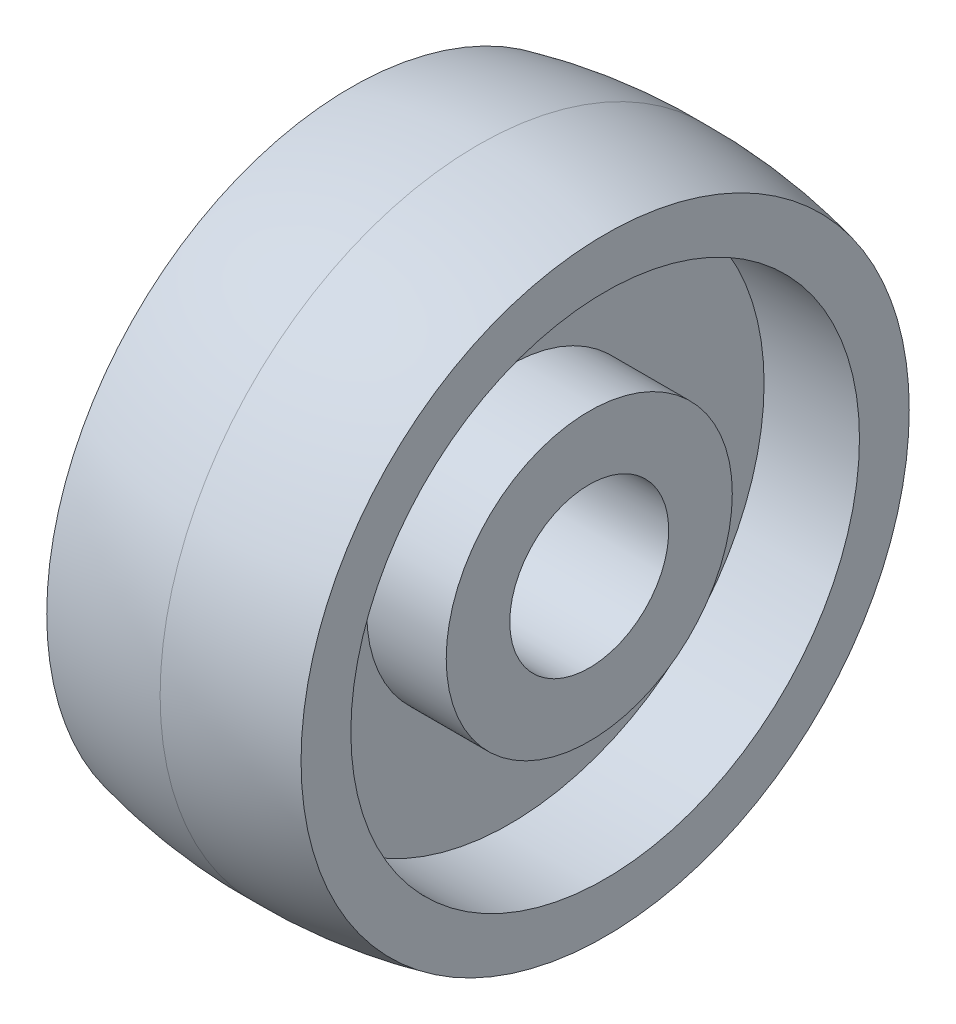
ISO-10303-21;
HEADER;
FILE_DESCRIPTION(('STEP AP214'),'2;1');
FILE_NAME('part.step','',(''),(''),'','','');
FILE_SCHEMA(('AUTOMOTIVE_DESIGN { 1 0 10303 214 1 1 1 1 }'));
ENDSEC;
DATA;
#1=APPLICATION_CONTEXT('core data for automotive mechanical design processes');
#2=APPLICATION_PROTOCOL_DEFINITION('international standard','automotive_design',2000,#1);
#3=PRODUCT_CONTEXT('',#1,'mechanical');
#4=PRODUCT('Part','Part','',(#3));
#5=PRODUCT_RELATED_PRODUCT_CATEGORY('part','',(#4));
#6=PRODUCT_DEFINITION_FORMATION('','',#4);
#7=PRODUCT_DEFINITION_CONTEXT('part definition',#1,'design');
#8=PRODUCT_DEFINITION('design','',#6,#7);
#9=PRODUCT_DEFINITION_SHAPE('','',#8);
#10=(LENGTH_UNIT() NAMED_UNIT(*) SI_UNIT(.MILLI.,.METRE.));
#11=(NAMED_UNIT(*) PLANE_ANGLE_UNIT() SI_UNIT($,.RADIAN.));
#12=(NAMED_UNIT(*) SI_UNIT($,.STERADIAN.) SOLID_ANGLE_UNIT());
#13=UNCERTAINTY_MEASURE_WITH_UNIT(LENGTH_MEASURE(1.E-05),#10,'distance_accuracy_value','');
#14=(GEOMETRIC_REPRESENTATION_CONTEXT(3) GLOBAL_UNCERTAINTY_ASSIGNED_CONTEXT((#13)) GLOBAL_UNIT_ASSIGNED_CONTEXT((#10,
#11,#12)) REPRESENTATION_CONTEXT('',''));
#15=CARTESIAN_POINT('',(0.,0.,0.));
#16=DIRECTION('',(0.,0.,1.));
#17=DIRECTION('',(1.,0.,0.));
#18=AXIS2_PLACEMENT_3D('',#15,#16,#17);
#19=CARTESIAN_POINT('',(1.38981076302772,0.,0.));
#20=DIRECTION('',(-1.,0.,0.));
#21=DIRECTION('',(0.,0.,1.));
#22=AXIS2_PLACEMENT_3D('',#19,#20,#21);
#23=DEGENERATE_TOROIDAL_SURFACE('',#22,13.9980575074667,34.,.F.);
#24=CARTESIAN_POINT('',(-6.24675324675326,0.,0.));
#25=DIRECTION('',(-1.,0.,0.));
#26=DIRECTION('',(0.,0.,1.));
#27=AXIS2_PLACEMENT_3D('',#24,#25,#26);
#28=CIRCLE('',#27,19.1332402353703);
#29=CARTESIAN_POINT('',(-6.24675324675326,0.,19.1332402353703));
#30=VERTEX_POINT('',#29);
#31=EDGE_CURVE('E77',#30,#30,#28,.T.);
#32=ORIENTED_EDGE('',*,*,#31,.F.);
#33=EDGE_LOOP('',(#32));
#34=FACE_BOUND('',#33,.T.);
#35=CARTESIAN_POINT('',(1.75324675324675,0.,0.));
#36=DIRECTION('',(-1.,0.,0.));
#37=DIRECTION('',(0.,0.,1.));
#38=AXIS2_PLACEMENT_3D('',#35,#36,#37);
#39=CIRCLE('',#38,20.);
#40=CARTESIAN_POINT('',(1.75324675324675,0.,20.));
#41=VERTEX_POINT('',#40);
#42=EDGE_CURVE('E10',#41,#41,#39,.T.);
#43=ORIENTED_EDGE('',*,*,#42,.T.);
#44=EDGE_LOOP('',(#43));
#45=FACE_BOUND('',#44,.T.);
#46=ADVANCED_FACE('F34',(#34,#45),#23,.F.);
#47=CARTESIAN_POINT('',(2.11668274346577,0.,0.));
#48=DIRECTION('',(-1.,0.,0.));
#49=DIRECTION('',(0.,0.,1.));
#50=AXIS2_PLACEMENT_3D('',#47,#48,#49);
#51=DEGENERATE_TOROIDAL_SURFACE('',#50,13.9980575074667,34.,.F.);
#52=ORIENTED_EDGE('',*,*,#42,.F.);
#53=EDGE_LOOP('',(#52));
#54=FACE_BOUND('',#53,.T.);
#55=CARTESIAN_POINT('',(9.75324675324674,0.,0.));
#56=DIRECTION('',(-1.,0.,0.));
#57=DIRECTION('',(0.,0.,1.));
#58=AXIS2_PLACEMENT_3D('',#55,#56,#57);
#59=CIRCLE('',#58,19.1332402353703);
#60=CARTESIAN_POINT('',(9.75324675324674,0.,19.1332402353703));
#61=VERTEX_POINT('',#60);
#62=EDGE_CURVE('E40',#61,#61,#59,.T.);
#63=ORIENTED_EDGE('',*,*,#62,.T.);
#64=EDGE_LOOP('',(#63));
#65=FACE_BOUND('',#64,.T.);
#66=ADVANCED_FACE('F84',(#54,#65),#51,.F.);
#67=CARTESIAN_POINT('',(9.75324675324675,16.,0.));
#68=DIRECTION('',(-1.,0.,0.));
#69=DIRECTION('',(0.,0.,1.));
#70=AXIS2_PLACEMENT_3D('',#67,#68,#69);
#71=PLANE('',#70);
#72=ORIENTED_EDGE('',*,*,#62,.F.);
#73=EDGE_LOOP('',(#72));
#74=FACE_BOUND('',#73,.T.);
#75=CARTESIAN_POINT('',(9.75324675324674,0.,0.));
#76=DIRECTION('',(-1.,0.,0.));
#77=DIRECTION('',(0.,0.,1.));
#78=AXIS2_PLACEMENT_3D('',#75,#76,#77);
#79=CIRCLE('',#78,16.);
#80=CARTESIAN_POINT('',(9.75324675324674,0.,16.));
#81=VERTEX_POINT('',#80);
#82=EDGE_CURVE('E44',#81,#81,#79,.T.);
#83=ORIENTED_EDGE('',*,*,#82,.T.);
#84=EDGE_LOOP('',(#83));
#85=FACE_BOUND('',#84,.T.);
#86=ADVANCED_FACE('F88',(#74,#85),#71,.F.);
#87=CARTESIAN_POINT('',(-14.8051948051948,0.,0.));
#88=DIRECTION('',(-1.,0.,0.));
#89=DIRECTION('',(0.,0.,1.));
#90=AXIS2_PLACEMENT_3D('',#87,#88,#89);
#91=CYLINDRICAL_SURFACE('',#90,16.);
#92=ORIENTED_EDGE('',*,*,#82,.F.);
#93=EDGE_LOOP('',(#92));
#94=FACE_BOUND('',#93,.T.);
#95=CARTESIAN_POINT('',(3.75324675324675,0.,0.));
#96=DIRECTION('',(-1.,0.,0.));
#97=DIRECTION('',(0.,0.,1.));
#98=AXIS2_PLACEMENT_3D('',#95,#96,#97);
#99=CIRCLE('',#98,16.);
#100=CARTESIAN_POINT('',(3.75324675324675,0.,16.));
#101=VERTEX_POINT('',#100);
#102=EDGE_CURVE('E48',#101,#101,#99,.T.);
#103=ORIENTED_EDGE('',*,*,#102,.T.);
#104=EDGE_LOOP('',(#103));
#105=FACE_BOUND('',#104,.T.);
#106=ADVANCED_FACE('F93',(#94,#105),#91,.F.);
#107=CARTESIAN_POINT('',(3.75324675324675,9.,0.));
#108=DIRECTION('',(-1.,0.,0.));
#109=DIRECTION('',(0.,0.,1.));
#110=AXIS2_PLACEMENT_3D('',#107,#108,#109);
#111=PLANE('',#110);
#112=ORIENTED_EDGE('',*,*,#102,.F.);
#113=EDGE_LOOP('',(#112));
#114=FACE_BOUND('',#113,.T.);
#115=CARTESIAN_POINT('',(3.75324675324675,0.,0.));
#116=DIRECTION('',(-1.,0.,0.));
#117=DIRECTION('',(0.,0.,1.));
#118=AXIS2_PLACEMENT_3D('',#115,#116,#117);
#119=CIRCLE('',#118,9.);
#120=CARTESIAN_POINT('',(3.75324675324675,0.,9.));
#121=VERTEX_POINT('',#120);
#122=EDGE_CURVE('E53',#121,#121,#119,.T.);
#123=ORIENTED_EDGE('',*,*,#122,.T.);
#124=EDGE_LOOP('',(#123));
#125=FACE_BOUND('',#124,.T.);
#126=ADVANCED_FACE('F99',(#114,#125),#111,.F.);
#127=CARTESIAN_POINT('',(-14.8051948051948,0.,0.));
#128=DIRECTION('',(-1.,0.,0.));
#129=DIRECTION('',(0.,0.,1.));
#130=AXIS2_PLACEMENT_3D('',#127,#128,#129);
#131=CYLINDRICAL_SURFACE('',#130,9.);
#132=ORIENTED_EDGE('',*,*,#122,.F.);
#133=EDGE_LOOP('',(#132));
#134=FACE_BOUND('',#133,.T.);
#135=CARTESIAN_POINT('',(8.75324675324674,0.,0.));
#136=DIRECTION('',(-1.,0.,0.));
#137=DIRECTION('',(0.,0.,1.));
#138=AXIS2_PLACEMENT_3D('',#135,#136,#137);
#139=CIRCLE('',#138,9.);
#140=CARTESIAN_POINT('',(8.75324675324674,0.,9.));
#141=VERTEX_POINT('',#140);
#142=EDGE_CURVE('E56',#141,#141,#139,.T.);
#143=ORIENTED_EDGE('',*,*,#142,.T.);
#144=EDGE_LOOP('',(#143));
#145=FACE_BOUND('',#144,.T.);
#146=ADVANCED_FACE('F103',(#134,#145),#131,.T.);
#147=CARTESIAN_POINT('',(8.75324675324675,5.,0.));
#148=DIRECTION('',(-1.,0.,0.));
#149=DIRECTION('',(0.,0.,1.));
#150=AXIS2_PLACEMENT_3D('',#147,#148,#149);
#151=PLANE('',#150);
#152=ORIENTED_EDGE('',*,*,#142,.F.);
#153=EDGE_LOOP('',(#152));
#154=FACE_BOUND('',#153,.T.);
#155=CARTESIAN_POINT('',(8.75324675324674,0.,0.));
#156=DIRECTION('',(-1.,0.,0.));
#157=DIRECTION('',(0.,0.,1.));
#158=AXIS2_PLACEMENT_3D('',#155,#156,#157);
#159=CIRCLE('',#158,5.);
#160=CARTESIAN_POINT('',(8.75324675324674,0.,5.));
#161=VERTEX_POINT('',#160);
#162=EDGE_CURVE('E59',#161,#161,#159,.T.);
#163=ORIENTED_EDGE('',*,*,#162,.T.);
#164=EDGE_LOOP('',(#163));
#165=FACE_BOUND('',#164,.T.);
#166=ADVANCED_FACE('F107',(#154,#165),#151,.F.);
#167=CARTESIAN_POINT('',(-14.8051948051948,0.,0.));
#168=DIRECTION('',(-1.,0.,0.));
#169=DIRECTION('',(0.,0.,1.));
#170=AXIS2_PLACEMENT_3D('',#167,#168,#169);
#171=CYLINDRICAL_SURFACE('',#170,5.);
#172=ORIENTED_EDGE('',*,*,#162,.F.);
#173=EDGE_LOOP('',(#172));
#174=FACE_BOUND('',#173,.T.);
#175=CARTESIAN_POINT('',(-5.24675324675326,0.,0.));
#176=DIRECTION('',(-1.,0.,0.));
#177=DIRECTION('',(0.,0.,1.));
#178=AXIS2_PLACEMENT_3D('',#175,#176,#177);
#179=CIRCLE('',#178,5.);
#180=CARTESIAN_POINT('',(-5.24675324675326,0.,5.));
#181=VERTEX_POINT('',#180);
#182=EDGE_CURVE('E62',#181,#181,#179,.T.);
#183=ORIENTED_EDGE('',*,*,#182,.T.);
#184=EDGE_LOOP('',(#183));
#185=FACE_BOUND('',#184,.T.);
#186=ADVANCED_FACE('F111',(#174,#185),#171,.F.);
#187=CARTESIAN_POINT('',(-5.24675324675326,5.,0.));
#188=DIRECTION('',(1.,0.,0.));
#189=DIRECTION('',(0.,0.,-1.));
#190=AXIS2_PLACEMENT_3D('',#187,#188,#189);
#191=PLANE('',#190);
#192=ORIENTED_EDGE('',*,*,#182,.F.);
#193=EDGE_LOOP('',(#192));
#194=FACE_BOUND('',#193,.T.);
#195=CARTESIAN_POINT('',(-5.24675324675326,0.,0.));
#196=DIRECTION('',(-1.,0.,0.));
#197=DIRECTION('',(0.,0.,1.));
#198=AXIS2_PLACEMENT_3D('',#195,#196,#197);
#199=CIRCLE('',#198,9.);
#200=CARTESIAN_POINT('',(-5.24675324675326,0.,9.));
#201=VERTEX_POINT('',#200);
#202=EDGE_CURVE('E65',#201,#201,#199,.T.);
#203=ORIENTED_EDGE('',*,*,#202,.T.);
#204=EDGE_LOOP('',(#203));
#205=FACE_BOUND('',#204,.T.);
#206=ADVANCED_FACE('F115',(#194,#205),#191,.F.);
#207=CARTESIAN_POINT('',(-14.8051948051948,0.,0.));
#208=DIRECTION('',(-1.,0.,0.));
#209=DIRECTION('',(0.,0.,1.));
#210=AXIS2_PLACEMENT_3D('',#207,#208,#209);
#211=CYLINDRICAL_SURFACE('',#210,9.);
#212=ORIENTED_EDGE('',*,*,#202,.F.);
#213=EDGE_LOOP('',(#212));
#214=FACE_BOUND('',#213,.T.);
#215=CARTESIAN_POINT('',(-0.246753246753254,0.,0.));
#216=DIRECTION('',(-1.,0.,0.));
#217=DIRECTION('',(0.,0.,1.));
#218=AXIS2_PLACEMENT_3D('',#215,#216,#217);
#219=CIRCLE('',#218,9.);
#220=CARTESIAN_POINT('',(-0.246753246753254,0.,9.));
#221=VERTEX_POINT('',#220);
#222=EDGE_CURVE('E68',#221,#221,#219,.T.);
#223=ORIENTED_EDGE('',*,*,#222,.T.);
#224=EDGE_LOOP('',(#223));
#225=FACE_BOUND('',#224,.T.);
#226=ADVANCED_FACE('F119',(#214,#225),#211,.T.);
#227=CARTESIAN_POINT('',(-0.246753246753255,9.,0.));
#228=DIRECTION('',(1.,0.,0.));
#229=DIRECTION('',(0.,0.,-1.));
#230=AXIS2_PLACEMENT_3D('',#227,#228,#229);
#231=PLANE('',#230);
#232=ORIENTED_EDGE('',*,*,#222,.F.);
#233=EDGE_LOOP('',(#232));
#234=FACE_BOUND('',#233,.T.);
#235=CARTESIAN_POINT('',(-0.246753246753254,0.,0.));
#236=DIRECTION('',(-1.,0.,0.));
#237=DIRECTION('',(0.,0.,1.));
#238=AXIS2_PLACEMENT_3D('',#235,#236,#237);
#239=CIRCLE('',#238,16.);
#240=CARTESIAN_POINT('',(-0.246753246753254,0.,16.));
#241=VERTEX_POINT('',#240);
#242=EDGE_CURVE('E71',#241,#241,#239,.T.);
#243=ORIENTED_EDGE('',*,*,#242,.T.);
#244=EDGE_LOOP('',(#243));
#245=FACE_BOUND('',#244,.T.);
#246=ADVANCED_FACE('F123',(#234,#245),#231,.F.);
#247=CARTESIAN_POINT('',(-14.8051948051948,0.,0.));
#248=DIRECTION('',(-1.,0.,0.));
#249=DIRECTION('',(0.,0.,1.));
#250=AXIS2_PLACEMENT_3D('',#247,#248,#249);
#251=CYLINDRICAL_SURFACE('',#250,16.);
#252=ORIENTED_EDGE('',*,*,#242,.F.);
#253=EDGE_LOOP('',(#252));
#254=FACE_BOUND('',#253,.T.);
#255=CARTESIAN_POINT('',(-6.24675324675325,0.,0.));
#256=DIRECTION('',(-1.,0.,0.));
#257=DIRECTION('',(0.,0.,1.));
#258=AXIS2_PLACEMENT_3D('',#255,#256,#257);
#259=CIRCLE('',#258,16.);
#260=CARTESIAN_POINT('',(-6.24675324675325,0.,16.));
#261=VERTEX_POINT('',#260);
#262=EDGE_CURVE('E74',#261,#261,#259,.T.);
#263=ORIENTED_EDGE('',*,*,#262,.T.);
#264=EDGE_LOOP('',(#263));
#265=FACE_BOUND('',#264,.T.);
#266=ADVANCED_FACE('F127',(#254,#265),#251,.F.);
#267=CARTESIAN_POINT('',(-6.24675324675326,16.,0.));
#268=DIRECTION('',(1.,0.,0.));
#269=DIRECTION('',(0.,0.,-1.));
#270=AXIS2_PLACEMENT_3D('',#267,#268,#269);
#271=PLANE('',#270);
#272=ORIENTED_EDGE('',*,*,#262,.F.);
#273=EDGE_LOOP('',(#272));
#274=FACE_BOUND('',#273,.T.);
#275=ORIENTED_EDGE('',*,*,#31,.T.);
#276=EDGE_LOOP('',(#275));
#277=FACE_BOUND('',#276,.T.);
#278=ADVANCED_FACE('F81',(#274,#277),#271,.F.);
#279=CLOSED_SHELL('',(#46,#66,#86,#106,#126,#146,#166,#186,#206,#226,#246,#266,#278));
#280=MANIFOLD_SOLID_BREP('B2',#279);
#281=ADVANCED_BREP_SHAPE_REPRESENTATION('',(#18,#280),#14);
#282=SHAPE_DEFINITION_REPRESENTATION(#9,#281);
ENDSEC;
END-ISO-10303-21;
